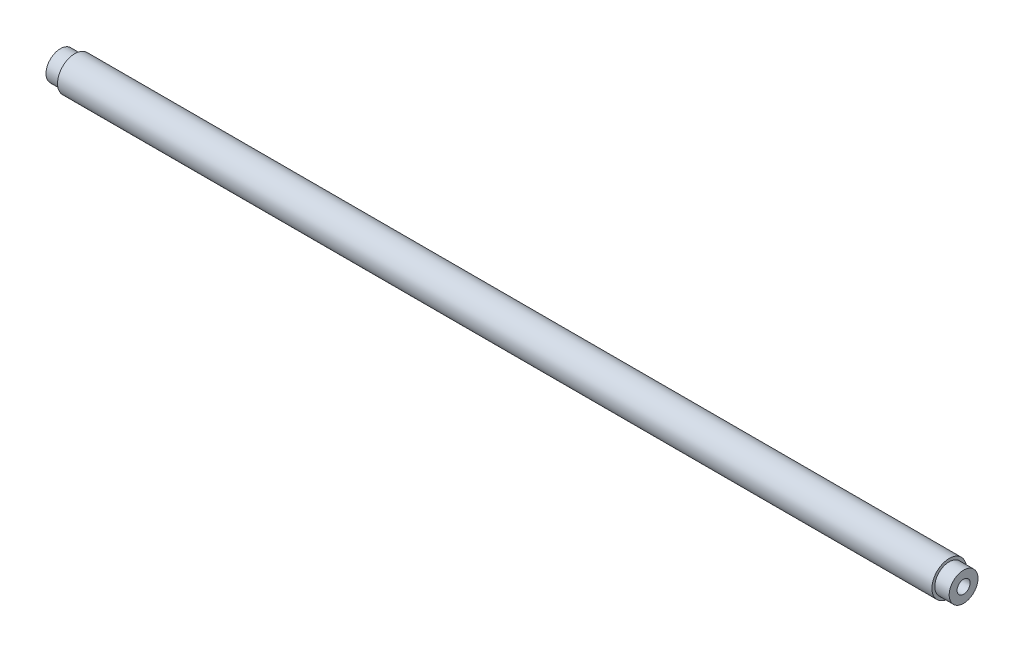
ISO-10303-21;
HEADER;
FILE_DESCRIPTION(('STEP AP214'),'2;1');
FILE_NAME('part.step','',(''),(''),'','','');
FILE_SCHEMA(('AUTOMOTIVE_DESIGN { 1 0 10303 214 1 1 1 1 }'));
ENDSEC;
DATA;
#1=APPLICATION_CONTEXT('core data for automotive mechanical design processes');
#2=APPLICATION_PROTOCOL_DEFINITION('international standard','automotive_design',2000,#1);
#3=PRODUCT_CONTEXT('',#1,'mechanical');
#4=PRODUCT('Part','Part','',(#3));
#5=PRODUCT_RELATED_PRODUCT_CATEGORY('part','',(#4));
#6=PRODUCT_DEFINITION_FORMATION('','',#4);
#7=PRODUCT_DEFINITION_CONTEXT('part definition',#1,'design');
#8=PRODUCT_DEFINITION('design','',#6,#7);
#9=PRODUCT_DEFINITION_SHAPE('','',#8);
#10=(LENGTH_UNIT() NAMED_UNIT(*) SI_UNIT(.MILLI.,.METRE.));
#11=(NAMED_UNIT(*) PLANE_ANGLE_UNIT() SI_UNIT($,.RADIAN.));
#12=(NAMED_UNIT(*) SI_UNIT($,.STERADIAN.) SOLID_ANGLE_UNIT());
#13=UNCERTAINTY_MEASURE_WITH_UNIT(LENGTH_MEASURE(1.E-05),#10,'distance_accuracy_value','');
#14=(GEOMETRIC_REPRESENTATION_CONTEXT(3) GLOBAL_UNCERTAINTY_ASSIGNED_CONTEXT((#13)) GLOBAL_UNIT_ASSIGNED_CONTEXT((#10,
#11,#12)) REPRESENTATION_CONTEXT('',''));
#15=CARTESIAN_POINT('',(0.,0.,0.));
#16=DIRECTION('',(0.,0.,1.));
#17=DIRECTION('',(1.,0.,0.));
#18=AXIS2_PLACEMENT_3D('',#15,#16,#17);
#19=CARTESIAN_POINT('',(-235.,0.,0.));
#20=DIRECTION('',(1.,0.,0.));
#21=DIRECTION('',(0.,1.,0.));
#22=AXIS2_PLACEMENT_3D('',#19,#20,#21);
#23=PLANE('',#22);
#24=CARTESIAN_POINT('',(-235.,0.,0.));
#25=DIRECTION('',(-1.,0.,0.));
#26=DIRECTION('',(0.,0.,1.));
#27=AXIS2_PLACEMENT_3D('',#24,#25,#26);
#28=CIRCLE('',#27,3.39999999999999);
#29=CARTESIAN_POINT('',(-235.,0.,3.39999999999999));
#30=VERTEX_POINT('',#29);
#31=EDGE_CURVE('E66',#30,#30,#28,.T.);
#32=ORIENTED_EDGE('',*,*,#31,.F.);
#33=EDGE_LOOP('',(#32));
#34=FACE_BOUND('',#33,.T.);
#35=CARTESIAN_POINT('',(-235.,0.,0.));
#36=DIRECTION('',(-1.,0.,0.));
#37=DIRECTION('',(0.,-1.,0.));
#38=AXIS2_PLACEMENT_3D('',#35,#36,#37);
#39=CIRCLE('',#38,7.5);
#40=CARTESIAN_POINT('',(-235.,-7.5,0.));
#41=VERTEX_POINT('',#40);
#42=EDGE_CURVE('E11',#41,#41,#39,.T.);
#43=ORIENTED_EDGE('',*,*,#42,.T.);
#44=EDGE_LOOP('',(#43));
#45=FACE_BOUND('',#44,.T.);
#46=ADVANCED_FACE('F43',(#34,#45),#23,.F.);
#47=CARTESIAN_POINT('',(-235.,0.,0.));
#48=DIRECTION('',(-1.,0.,0.));
#49=DIRECTION('',(0.,-1.,0.));
#50=AXIS2_PLACEMENT_3D('',#47,#48,#49);
#51=CYLINDRICAL_SURFACE('',#50,7.5);
#52=ORIENTED_EDGE('',*,*,#42,.F.);
#53=EDGE_LOOP('',(#52));
#54=FACE_BOUND('',#53,.T.);
#55=CARTESIAN_POINT('',(-227.5,0.,0.));
#56=DIRECTION('',(-1.,0.,0.));
#57=DIRECTION('',(0.,-1.,0.));
#58=AXIS2_PLACEMENT_3D('',#55,#56,#57);
#59=CIRCLE('',#58,7.5);
#60=CARTESIAN_POINT('',(-227.5,-7.5,0.));
#61=VERTEX_POINT('',#60);
#62=EDGE_CURVE('E50',#61,#61,#59,.T.);
#63=ORIENTED_EDGE('',*,*,#62,.T.);
#64=EDGE_LOOP('',(#63));
#65=FACE_BOUND('',#64,.T.);
#66=ADVANCED_FACE('F91',(#54,#65),#51,.T.);
#67=CARTESIAN_POINT('',(-227.5,7.5,0.));
#68=DIRECTION('',(1.,0.,0.));
#69=DIRECTION('',(0.,1.,0.));
#70=AXIS2_PLACEMENT_3D('',#67,#68,#69);
#71=PLANE('',#70);
#72=ORIENTED_EDGE('',*,*,#62,.F.);
#73=EDGE_LOOP('',(#72));
#74=FACE_BOUND('',#73,.T.);
#75=CARTESIAN_POINT('',(-227.5,0.,0.));
#76=DIRECTION('',(-1.,0.,0.));
#77=DIRECTION('',(0.,-1.,0.));
#78=AXIS2_PLACEMENT_3D('',#75,#76,#77);
#79=CIRCLE('',#78,9.);
#80=CARTESIAN_POINT('',(-227.5,-9.,0.));
#81=VERTEX_POINT('',#80);
#82=EDGE_CURVE('E86',#81,#81,#79,.T.);
#83=ORIENTED_EDGE('',*,*,#82,.T.);
#84=EDGE_LOOP('',(#83));
#85=FACE_BOUND('',#84,.T.);
#86=ADVANCED_FACE('F93',(#74,#85),#71,.F.);
#87=CARTESIAN_POINT('',(-235.,0.,0.));
#88=DIRECTION('',(-1.,0.,0.));
#89=DIRECTION('',(0.,-1.,0.));
#90=AXIS2_PLACEMENT_3D('',#87,#88,#89);
#91=CYLINDRICAL_SURFACE('',#90,9.);
#92=ORIENTED_EDGE('',*,*,#82,.F.);
#93=EDGE_LOOP('',(#92));
#94=FACE_BOUND('',#93,.T.);
#95=CARTESIAN_POINT('',(227.5,0.,0.));
#96=DIRECTION('',(-1.,0.,0.));
#97=DIRECTION('',(0.,-1.,0.));
#98=AXIS2_PLACEMENT_3D('',#95,#96,#97);
#99=CIRCLE('',#98,9.);
#100=CARTESIAN_POINT('',(227.5,-8.99999999999991,0.));
#101=VERTEX_POINT('',#100);
#102=EDGE_CURVE('E83',#101,#101,#99,.T.);
#103=ORIENTED_EDGE('',*,*,#102,.T.);
#104=EDGE_LOOP('',(#103));
#105=FACE_BOUND('',#104,.T.);
#106=ADVANCED_FACE('F96',(#94,#105),#91,.T.);
#107=CARTESIAN_POINT('',(227.5,9.00000000000008,0.));
#108=DIRECTION('',(-1.,0.,0.));
#109=DIRECTION('',(0.,-1.,0.));
#110=AXIS2_PLACEMENT_3D('',#107,#108,#109);
#111=PLANE('',#110);
#112=ORIENTED_EDGE('',*,*,#102,.F.);
#113=EDGE_LOOP('',(#112));
#114=FACE_BOUND('',#113,.T.);
#115=CARTESIAN_POINT('',(227.5,0.,0.));
#116=DIRECTION('',(-1.,0.,0.));
#117=DIRECTION('',(0.,-1.,0.));
#118=AXIS2_PLACEMENT_3D('',#115,#116,#117);
#119=CIRCLE('',#118,7.5);
#120=CARTESIAN_POINT('',(227.5,-7.49999999999991,0.));
#121=VERTEX_POINT('',#120);
#122=EDGE_CURVE('E80',#121,#121,#119,.T.);
#123=ORIENTED_EDGE('',*,*,#122,.T.);
#124=EDGE_LOOP('',(#123));
#125=FACE_BOUND('',#124,.T.);
#126=ADVANCED_FACE('F102',(#114,#125),#111,.F.);
#127=CARTESIAN_POINT('',(-235.,0.,0.));
#128=DIRECTION('',(-1.,0.,0.));
#129=DIRECTION('',(0.,-1.,0.));
#130=AXIS2_PLACEMENT_3D('',#127,#128,#129);
#131=CYLINDRICAL_SURFACE('',#130,7.5);
#132=ORIENTED_EDGE('',*,*,#122,.F.);
#133=EDGE_LOOP('',(#132));
#134=FACE_BOUND('',#133,.T.);
#135=CARTESIAN_POINT('',(235.,0.,0.));
#136=DIRECTION('',(-1.,0.,0.));
#137=DIRECTION('',(0.,-1.,0.));
#138=AXIS2_PLACEMENT_3D('',#135,#136,#137);
#139=CIRCLE('',#138,7.5);
#140=CARTESIAN_POINT('',(235.,-7.49999999999991,0.));
#141=VERTEX_POINT('',#140);
#142=EDGE_CURVE('E77',#141,#141,#139,.T.);
#143=ORIENTED_EDGE('',*,*,#142,.T.);
#144=EDGE_LOOP('',(#143));
#145=FACE_BOUND('',#144,.T.);
#146=ADVANCED_FACE('F108',(#134,#145),#131,.T.);
#147=CARTESIAN_POINT('',(235.,7.50000000000009,0.));
#148=DIRECTION('',(-1.,0.,0.));
#149=DIRECTION('',(0.,-1.,0.));
#150=AXIS2_PLACEMENT_3D('',#147,#148,#149);
#151=PLANE('',#150);
#152=CARTESIAN_POINT('',(235.,0.,0.));
#153=DIRECTION('',(1.,0.,0.));
#154=DIRECTION('',(0.,0.,-1.));
#155=AXIS2_PLACEMENT_3D('',#152,#153,#154);
#156=CIRCLE('',#155,3.39999999999999);
#157=CARTESIAN_POINT('',(235.,0.,-3.39999999999999));
#158=VERTEX_POINT('',#157);
#159=EDGE_CURVE('E67',#158,#158,#156,.T.);
#160=ORIENTED_EDGE('',*,*,#159,.F.);
#161=EDGE_LOOP('',(#160));
#162=FACE_BOUND('',#161,.T.);
#163=ORIENTED_EDGE('',*,*,#142,.F.);
#164=EDGE_LOOP('',(#163));
#165=FACE_BOUND('',#164,.T.);
#166=ADVANCED_FACE('F114',(#162,#165),#151,.F.);
#167=CARTESIAN_POINT('',(-212.75,0.,0.));
#168=DIRECTION('',(-1.,0.,0.));
#169=DIRECTION('',(0.,0.,1.));
#170=AXIS2_PLACEMENT_3D('',#167,#168,#169);
#171=CONICAL_SURFACE('',#170,3.39999999999999,1.02974425867665);
#172=CARTESIAN_POINT('',(-210.707073895306,0.,0.));
#173=VERTEX_POINT('',#172);
#174=VERTEX_LOOP('',#173);
#175=FACE_BOUND('',#174,.T.);
#176=CARTESIAN_POINT('',(-212.75,0.,0.));
#177=DIRECTION('',(-1.,0.,0.));
#178=DIRECTION('',(0.,0.,1.));
#179=AXIS2_PLACEMENT_3D('',#176,#177,#178);
#180=CIRCLE('',#179,3.39999999999999);
#181=CARTESIAN_POINT('',(-212.75,0.,3.39999999999999));
#182=VERTEX_POINT('',#181);
#183=EDGE_CURVE('E70',#182,#182,#180,.T.);
#184=ORIENTED_EDGE('',*,*,#183,.T.);
#185=EDGE_LOOP('',(#184));
#186=FACE_BOUND('',#185,.T.);
#187=ADVANCED_FACE('F119',(#175,#186),#171,.F.);
#188=CARTESIAN_POINT('',(-235.,0.,0.));
#189=DIRECTION('',(-1.,0.,0.));
#190=DIRECTION('',(0.,0.,1.));
#191=AXIS2_PLACEMENT_3D('',#188,#189,#190);
#192=CYLINDRICAL_SURFACE('',#191,3.39999999999999);
#193=ORIENTED_EDGE('',*,*,#183,.F.);
#194=EDGE_LOOP('',(#193));
#195=FACE_BOUND('',#194,.T.);
#196=ORIENTED_EDGE('',*,*,#31,.T.);
#197=EDGE_LOOP('',(#196));
#198=FACE_BOUND('',#197,.T.);
#199=ADVANCED_FACE('F60',(#195,#198),#192,.F.);
#200=CARTESIAN_POINT('',(212.75,0.,0.));
#201=DIRECTION('',(1.,0.,0.));
#202=DIRECTION('',(0.,0.,-1.));
#203=AXIS2_PLACEMENT_3D('',#200,#201,#202);
#204=CONICAL_SURFACE('',#203,3.39999999999999,1.02974425867665);
#205=CARTESIAN_POINT('',(210.707073895306,0.,0.));
#206=VERTEX_POINT('',#205);
#207=VERTEX_LOOP('',#206);
#208=FACE_BOUND('',#207,.T.);
#209=CARTESIAN_POINT('',(212.75,0.,0.));
#210=DIRECTION('',(1.,0.,0.));
#211=DIRECTION('',(0.,0.,-1.));
#212=AXIS2_PLACEMENT_3D('',#209,#210,#211);
#213=CIRCLE('',#212,3.39999999999999);
#214=CARTESIAN_POINT('',(212.75,0.,-3.39999999999999));
#215=VERTEX_POINT('',#214);
#216=EDGE_CURVE('E64',#215,#215,#213,.T.);
#217=ORIENTED_EDGE('',*,*,#216,.T.);
#218=EDGE_LOOP('',(#217));
#219=FACE_BOUND('',#218,.T.);
#220=ADVANCED_FACE('F56',(#208,#219),#204,.F.);
#221=CARTESIAN_POINT('',(235.,0.,0.));
#222=DIRECTION('',(1.,0.,0.));
#223=DIRECTION('',(0.,0.,-1.));
#224=AXIS2_PLACEMENT_3D('',#221,#222,#223);
#225=CYLINDRICAL_SURFACE('',#224,3.39999999999999);
#226=ORIENTED_EDGE('',*,*,#216,.F.);
#227=EDGE_LOOP('',(#226));
#228=FACE_BOUND('',#227,.T.);
#229=ORIENTED_EDGE('',*,*,#159,.T.);
#230=EDGE_LOOP('',(#229));
#231=FACE_BOUND('',#230,.T.);
#232=ADVANCED_FACE('F59',(#228,#231),#225,.F.);
#233=CLOSED_SHELL('',(#46,#66,#86,#106,#126,#146,#166,#187,#199,#220,#232));
#234=MANIFOLD_SOLID_BREP('B2',#233);
#235=ADVANCED_BREP_SHAPE_REPRESENTATION('',(#18,#234),#14);
#236=SHAPE_DEFINITION_REPRESENTATION(#9,#235);
ENDSEC;
END-ISO-10303-21;
